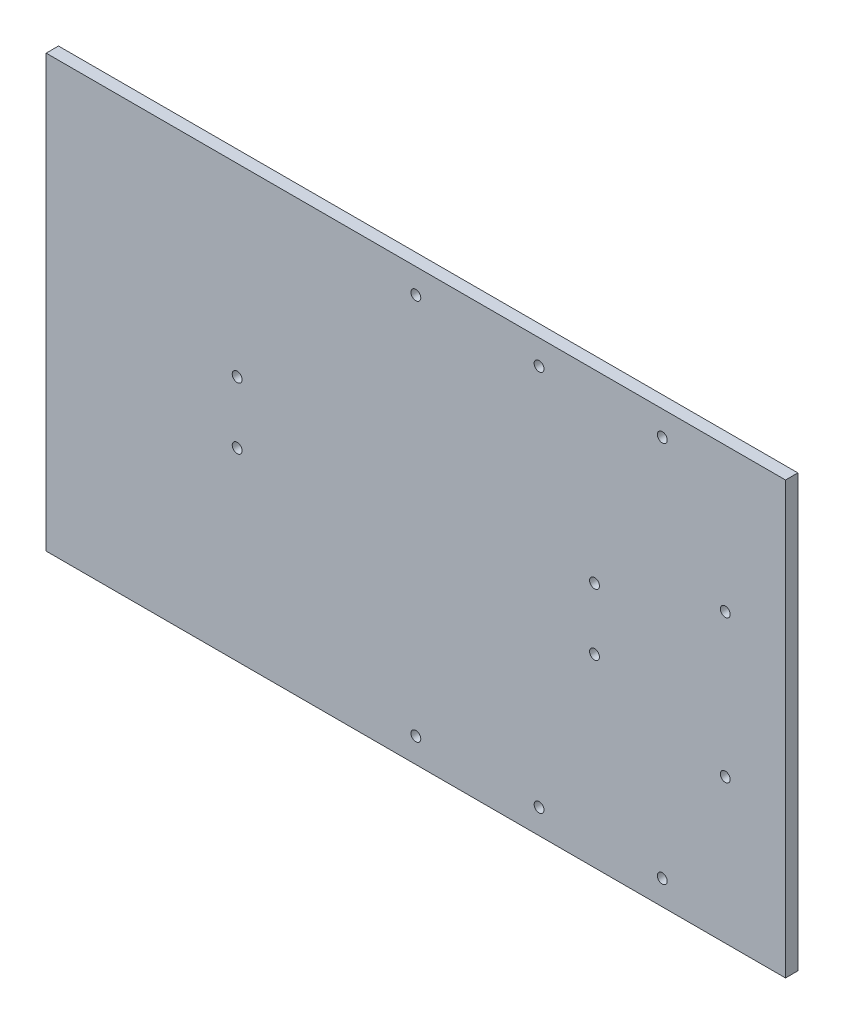
ISO-10303-21;
HEADER;
FILE_DESCRIPTION(('STEP AP214'),'2;1');
FILE_NAME('part.step','',(''),(''),'','','');
FILE_SCHEMA(('AUTOMOTIVE_DESIGN { 1 0 10303 214 1 1 1 1 }'));
ENDSEC;
DATA;
#1=APPLICATION_CONTEXT('core data for automotive mechanical design processes');
#2=APPLICATION_PROTOCOL_DEFINITION('international standard','automotive_design',2000,#1);
#3=PRODUCT_CONTEXT('',#1,'mechanical');
#4=PRODUCT('Part','Part','',(#3));
#5=PRODUCT_RELATED_PRODUCT_CATEGORY('part','',(#4));
#6=PRODUCT_DEFINITION_FORMATION('','',#4);
#7=PRODUCT_DEFINITION_CONTEXT('part definition',#1,'design');
#8=PRODUCT_DEFINITION('design','',#6,#7);
#9=PRODUCT_DEFINITION_SHAPE('','',#8);
#10=(LENGTH_UNIT() NAMED_UNIT(*) SI_UNIT(.MILLI.,.METRE.));
#11=(NAMED_UNIT(*) PLANE_ANGLE_UNIT() SI_UNIT($,.RADIAN.));
#12=(NAMED_UNIT(*) SI_UNIT($,.STERADIAN.) SOLID_ANGLE_UNIT());
#13=UNCERTAINTY_MEASURE_WITH_UNIT(LENGTH_MEASURE(1.E-05),#10,'distance_accuracy_value','');
#14=(GEOMETRIC_REPRESENTATION_CONTEXT(3) GLOBAL_UNCERTAINTY_ASSIGNED_CONTEXT((#13)) GLOBAL_UNIT_ASSIGNED_CONTEXT((#10,
#11,#12)) REPRESENTATION_CONTEXT('',''));
#15=CARTESIAN_POINT('',(0.,0.,0.));
#16=DIRECTION('',(0.,0.,1.));
#17=DIRECTION('',(1.,0.,0.));
#18=AXIS2_PLACEMENT_3D('',#15,#16,#17);
#19=CARTESIAN_POINT('',(0.,0.,10.));
#20=DIRECTION('',(-1.,0.,0.));
#21=DIRECTION('',(0.,0.,1.));
#22=AXIS2_PLACEMENT_3D('',#19,#20,#21);
#23=PLANE('',#22);
#24=DIRECTION('',(0.,1.,0.));
#25=VECTOR('',#24,1.);
#26=CARTESIAN_POINT('',(0.,0.,0.));
#27=LINE('',#26,#25);
#28=CARTESIAN_POINT('',(0.,0.,0.));
#29=VERTEX_POINT('',#28);
#30=CARTESIAN_POINT('',(0.,350.,0.));
#31=VERTEX_POINT('',#30);
#32=EDGE_CURVE('E97',#29,#31,#27,.T.);
#33=ORIENTED_EDGE('',*,*,#32,.T.);
#34=DIRECTION('',(0.,0.,-1.));
#35=VECTOR('',#34,1.);
#36=CARTESIAN_POINT('',(0.,350.,10.));
#37=LINE('',#36,#35);
#38=CARTESIAN_POINT('',(0.,350.,10.));
#39=VERTEX_POINT('',#38);
#40=EDGE_CURVE('E11',#39,#31,#37,.T.);
#41=ORIENTED_EDGE('',*,*,#40,.F.);
#42=DIRECTION('',(0.,1.,0.));
#43=VECTOR('',#42,1.);
#44=CARTESIAN_POINT('',(0.,0.,10.));
#45=LINE('',#44,#43);
#46=CARTESIAN_POINT('',(0.,0.,10.));
#47=VERTEX_POINT('',#46);
#48=EDGE_CURVE('E85',#47,#39,#45,.T.);
#49=ORIENTED_EDGE('',*,*,#48,.F.);
#50=DIRECTION('',(0.,0.,-1.));
#51=VECTOR('',#50,1.);
#52=CARTESIAN_POINT('',(0.,0.,10.));
#53=LINE('',#52,#51);
#54=EDGE_CURVE('E93',#47,#29,#53,.T.);
#55=ORIENTED_EDGE('',*,*,#54,.T.);
#56=EDGE_LOOP('',(#33,#41,#49,#55));
#57=FACE_BOUND('',#56,.T.);
#58=ADVANCED_FACE('F34',(#57),#23,.F.);
#59=CARTESIAN_POINT('',(0.,350.,10.));
#60=DIRECTION('',(0.,-1.,0.));
#61=DIRECTION('',(0.,0.,-1.));
#62=AXIS2_PLACEMENT_3D('',#59,#60,#61);
#63=PLANE('',#62);
#64=DIRECTION('',(-1.,0.,0.));
#65=VECTOR('',#64,1.);
#66=CARTESIAN_POINT('',(0.,350.,0.));
#67=LINE('',#66,#65);
#68=CARTESIAN_POINT('',(-600.,350.,0.));
#69=VERTEX_POINT('',#68);
#70=EDGE_CURVE('E89',#31,#69,#67,.T.);
#71=ORIENTED_EDGE('',*,*,#70,.T.);
#72=DIRECTION('',(0.,0.,-1.));
#73=VECTOR('',#72,1.);
#74=CARTESIAN_POINT('',(-600.,350.,10.));
#75=LINE('',#74,#73);
#76=CARTESIAN_POINT('',(-600.,350.,10.));
#77=VERTEX_POINT('',#76);
#78=EDGE_CURVE('E42',#77,#69,#75,.T.);
#79=ORIENTED_EDGE('',*,*,#78,.F.);
#80=DIRECTION('',(-1.,0.,0.));
#81=VECTOR('',#80,1.);
#82=CARTESIAN_POINT('',(0.,350.,10.));
#83=LINE('',#82,#81);
#84=EDGE_CURVE('E80',#39,#77,#83,.T.);
#85=ORIENTED_EDGE('',*,*,#84,.F.);
#86=ORIENTED_EDGE('',*,*,#40,.T.);
#87=EDGE_LOOP('',(#71,#79,#85,#86));
#88=FACE_BOUND('',#87,.T.);
#89=ADVANCED_FACE('F88',(#88),#63,.F.);
#90=CARTESIAN_POINT('',(-600.,0.,10.));
#91=DIRECTION('',(1.,0.,0.));
#92=DIRECTION('',(0.,0.,-1.));
#93=AXIS2_PLACEMENT_3D('',#90,#91,#92);
#94=PLANE('',#93);
#95=DIRECTION('',(0.,-1.,0.));
#96=VECTOR('',#95,1.);
#97=CARTESIAN_POINT('',(-600.,0.,0.));
#98=LINE('',#97,#96);
#99=CARTESIAN_POINT('',(-600.,0.,0.));
#100=VERTEX_POINT('',#99);
#101=EDGE_CURVE('E67',#69,#100,#98,.T.);
#102=ORIENTED_EDGE('',*,*,#101,.T.);
#103=DIRECTION('',(0.,0.,-1.));
#104=VECTOR('',#103,1.);
#105=CARTESIAN_POINT('',(-600.,0.,10.));
#106=LINE('',#105,#104);
#107=CARTESIAN_POINT('',(-600.,0.,10.));
#108=VERTEX_POINT('',#107);
#109=EDGE_CURVE('E90',#108,#100,#106,.T.);
#110=ORIENTED_EDGE('',*,*,#109,.F.);
#111=DIRECTION('',(0.,-1.,0.));
#112=VECTOR('',#111,1.);
#113=CARTESIAN_POINT('',(-600.,0.,10.));
#114=LINE('',#113,#112);
#115=EDGE_CURVE('E83',#77,#108,#114,.T.);
#116=ORIENTED_EDGE('',*,*,#115,.F.);
#117=ORIENTED_EDGE('',*,*,#78,.T.);
#118=EDGE_LOOP('',(#102,#110,#116,#117));
#119=FACE_BOUND('',#118,.T.);
#120=ADVANCED_FACE('F91',(#119),#94,.F.);
#121=CARTESIAN_POINT('',(0.,0.,10.));
#122=DIRECTION('',(0.,1.,0.));
#123=DIRECTION('',(-1.,0.,0.));
#124=AXIS2_PLACEMENT_3D('',#121,#122,#123);
#125=PLANE('',#124);
#126=DIRECTION('',(1.,0.,0.));
#127=VECTOR('',#126,1.);
#128=CARTESIAN_POINT('',(0.,0.,0.));
#129=LINE('',#128,#127);
#130=EDGE_CURVE('E73',#100,#29,#129,.T.);
#131=ORIENTED_EDGE('',*,*,#130,.T.);
#132=ORIENTED_EDGE('',*,*,#54,.F.);
#133=DIRECTION('',(1.,0.,0.));
#134=VECTOR('',#133,1.);
#135=CARTESIAN_POINT('',(0.,0.,10.));
#136=LINE('',#135,#134);
#137=EDGE_CURVE('E50',#108,#47,#136,.T.);
#138=ORIENTED_EDGE('',*,*,#137,.F.);
#139=ORIENTED_EDGE('',*,*,#109,.T.);
#140=EDGE_LOOP('',(#131,#132,#138,#139));
#141=FACE_BOUND('',#140,.T.);
#142=ADVANCED_FACE('F105',(#141),#125,.F.);
#143=CARTESIAN_POINT('',(0.,0.,10.));
#144=DIRECTION('',(0.,0.,1.));
#145=DIRECTION('',(1.,0.,0.));
#146=AXIS2_PLACEMENT_3D('',#143,#144,#145);
#147=PLANE('',#146);
#148=CARTESIAN_POINT('',(-155.,200.,10.));
#149=DIRECTION('',(0.,0.,1.));
#150=DIRECTION('',(1.,0.,0.));
#151=AXIS2_PLACEMENT_3D('',#148,#149,#150);
#152=CIRCLE('',#151,3.99999999999999);
#153=CARTESIAN_POINT('',(-151.,200.,10.));
#154=VERTEX_POINT('',#153);
#155=EDGE_CURVE('E172',#154,#154,#152,.F.);
#156=ORIENTED_EDGE('',*,*,#155,.T.);
#157=EDGE_LOOP('',(#156));
#158=FACE_BOUND('',#157,.T.);
#159=CARTESIAN_POINT('',(-445.,150.,10.));
#160=DIRECTION('',(0.,0.,1.));
#161=DIRECTION('',(1.,0.,0.));
#162=AXIS2_PLACEMENT_3D('',#159,#160,#161);
#163=CIRCLE('',#162,3.99999999999999);
#164=CARTESIAN_POINT('',(-441.,150.,10.));
#165=VERTEX_POINT('',#164);
#166=EDGE_CURVE('E165',#165,#165,#163,.F.);
#167=ORIENTED_EDGE('',*,*,#166,.T.);
#168=EDGE_LOOP('',(#167));
#169=FACE_BOUND('',#168,.T.);
#170=CARTESIAN_POINT('',(-445.,200.,10.));
#171=DIRECTION('',(0.,0.,1.));
#172=DIRECTION('',(1.,0.,0.));
#173=AXIS2_PLACEMENT_3D('',#170,#171,#172);
#174=CIRCLE('',#173,3.99999999999999);
#175=CARTESIAN_POINT('',(-441.,200.,10.));
#176=VERTEX_POINT('',#175);
#177=EDGE_CURVE('E177',#176,#176,#174,.F.);
#178=ORIENTED_EDGE('',*,*,#177,.T.);
#179=EDGE_LOOP('',(#178));
#180=FACE_BOUND('',#179,.T.);
#181=CARTESIAN_POINT('',(-155.,150.,10.));
#182=DIRECTION('',(0.,0.,1.));
#183=DIRECTION('',(1.,0.,0.));
#184=AXIS2_PLACEMENT_3D('',#181,#182,#183);
#185=CIRCLE('',#184,3.99999999999999);
#186=CARTESIAN_POINT('',(-151.,150.,10.));
#187=VERTEX_POINT('',#186);
#188=EDGE_CURVE('E159',#187,#187,#185,.F.);
#189=ORIENTED_EDGE('',*,*,#188,.T.);
#190=EDGE_LOOP('',(#189));
#191=FACE_BOUND('',#190,.T.);
#192=CARTESIAN_POINT('',(-48.9145975399393,233.,10.));
#193=DIRECTION('',(0.,0.,-1.));
#194=DIRECTION('',(-1.,0.,0.));
#195=AXIS2_PLACEMENT_3D('',#192,#193,#194);
#196=CIRCLE('',#195,4.);
#197=CARTESIAN_POINT('',(-52.9145975399393,233.,10.));
#198=VERTEX_POINT('',#197);
#199=EDGE_CURVE('E121',#198,#198,#196,.T.);
#200=ORIENTED_EDGE('',*,*,#199,.T.);
#201=EDGE_LOOP('',(#200));
#202=FACE_BOUND('',#201,.T.);
#203=CARTESIAN_POINT('',(-48.9145975399393,117.,10.));
#204=DIRECTION('',(0.,0.,-1.));
#205=DIRECTION('',(1.,0.,0.));
#206=AXIS2_PLACEMENT_3D('',#203,#204,#205);
#207=CIRCLE('',#206,4.);
#208=CARTESIAN_POINT('',(-44.9145975399393,117.,10.));
#209=VERTEX_POINT('',#208);
#210=EDGE_CURVE('E150',#209,#209,#207,.T.);
#211=ORIENTED_EDGE('',*,*,#210,.T.);
#212=EDGE_LOOP('',(#211));
#213=FACE_BOUND('',#212,.T.);
#214=CARTESIAN_POINT('',(-100.,20.,10.));
#215=DIRECTION('',(0.,0.,-1.));
#216=DIRECTION('',(1.,0.,0.));
#217=AXIS2_PLACEMENT_3D('',#214,#215,#216);
#218=CIRCLE('',#217,4.00000000000001);
#219=CARTESIAN_POINT('',(-96.,20.,10.));
#220=VERTEX_POINT('',#219);
#221=EDGE_CURVE('E120',#220,#220,#218,.T.);
#222=ORIENTED_EDGE('',*,*,#221,.T.);
#223=EDGE_LOOP('',(#222));
#224=FACE_BOUND('',#223,.T.);
#225=CARTESIAN_POINT('',(-200.,20.,10.));
#226=DIRECTION('',(0.,0.,-1.));
#227=DIRECTION('',(1.,0.,0.));
#228=AXIS2_PLACEMENT_3D('',#225,#226,#227);
#229=CIRCLE('',#228,3.99999999999999);
#230=CARTESIAN_POINT('',(-196.,20.,10.));
#231=VERTEX_POINT('',#230);
#232=EDGE_CURVE('E127',#231,#231,#229,.T.);
#233=ORIENTED_EDGE('',*,*,#232,.T.);
#234=EDGE_LOOP('',(#233));
#235=FACE_BOUND('',#234,.T.);
#236=CARTESIAN_POINT('',(-300.,20.,10.));
#237=DIRECTION('',(0.,0.,-1.));
#238=DIRECTION('',(1.,0.,0.));
#239=AXIS2_PLACEMENT_3D('',#236,#237,#238);
#240=CIRCLE('',#239,3.99999999999999);
#241=CARTESIAN_POINT('',(-296.,20.,10.));
#242=VERTEX_POINT('',#241);
#243=EDGE_CURVE('E133',#242,#242,#240,.T.);
#244=ORIENTED_EDGE('',*,*,#243,.T.);
#245=EDGE_LOOP('',(#244));
#246=FACE_BOUND('',#245,.T.);
#247=CARTESIAN_POINT('',(-300.,330.,10.));
#248=DIRECTION('',(0.,0.,-1.));
#249=DIRECTION('',(-1.,0.,0.));
#250=AXIS2_PLACEMENT_3D('',#247,#248,#249);
#251=CIRCLE('',#250,3.99999999999999);
#252=CARTESIAN_POINT('',(-304.,330.,10.));
#253=VERTEX_POINT('',#252);
#254=EDGE_CURVE('E139',#253,#253,#251,.T.);
#255=ORIENTED_EDGE('',*,*,#254,.T.);
#256=EDGE_LOOP('',(#255));
#257=FACE_BOUND('',#256,.T.);
#258=CARTESIAN_POINT('',(-200.,330.,10.));
#259=DIRECTION('',(0.,0.,-1.));
#260=DIRECTION('',(-1.,0.,0.));
#261=AXIS2_PLACEMENT_3D('',#258,#259,#260);
#262=CIRCLE('',#261,3.99999999999999);
#263=CARTESIAN_POINT('',(-204.,330.,10.));
#264=VERTEX_POINT('',#263);
#265=EDGE_CURVE('E114',#264,#264,#262,.T.);
#266=ORIENTED_EDGE('',*,*,#265,.T.);
#267=EDGE_LOOP('',(#266));
#268=FACE_BOUND('',#267,.T.);
#269=CARTESIAN_POINT('',(-100.,330.,10.));
#270=DIRECTION('',(0.,0.,-1.));
#271=DIRECTION('',(-1.,0.,0.));
#272=AXIS2_PLACEMENT_3D('',#269,#270,#271);
#273=CIRCLE('',#272,4.00000000000001);
#274=CARTESIAN_POINT('',(-104.,330.,10.));
#275=VERTEX_POINT('',#274);
#276=EDGE_CURVE('E100',#275,#275,#273,.T.);
#277=ORIENTED_EDGE('',*,*,#276,.T.);
#278=EDGE_LOOP('',(#277));
#279=FACE_BOUND('',#278,.T.);
#280=ORIENTED_EDGE('',*,*,#48,.T.);
#281=ORIENTED_EDGE('',*,*,#84,.T.);
#282=ORIENTED_EDGE('',*,*,#115,.T.);
#283=ORIENTED_EDGE('',*,*,#137,.T.);
#284=EDGE_LOOP('',(#280,#281,#282,#283));
#285=FACE_BOUND('',#284,.T.);
#286=ADVANCED_FACE('F81',(#158,#169,#180,#191,#202,#213,#224,#235,#246,#257,#268,#279,#285),
#147,.T.);
#287=CARTESIAN_POINT('',(0.,0.,0.));
#288=DIRECTION('',(0.,0.,1.));
#289=DIRECTION('',(1.,0.,0.));
#290=AXIS2_PLACEMENT_3D('',#287,#288,#289);
#291=PLANE('',#290);
#292=CARTESIAN_POINT('',(-155.,200.,0.));
#293=DIRECTION('',(0.,0.,-1.));
#294=DIRECTION('',(1.,0.,0.));
#295=AXIS2_PLACEMENT_3D('',#292,#293,#294);
#296=CIRCLE('',#295,3.99999999999999);
#297=CARTESIAN_POINT('',(-151.,200.,0.));
#298=VERTEX_POINT('',#297);
#299=EDGE_CURVE('E162',#298,#298,#296,.T.);
#300=ORIENTED_EDGE('',*,*,#299,.F.);
#301=EDGE_LOOP('',(#300));
#302=FACE_BOUND('',#301,.T.);
#303=CARTESIAN_POINT('',(-445.,150.,0.));
#304=DIRECTION('',(0.,0.,-1.));
#305=DIRECTION('',(1.,0.,0.));
#306=AXIS2_PLACEMENT_3D('',#303,#304,#305);
#307=CIRCLE('',#306,3.99999999999999);
#308=CARTESIAN_POINT('',(-441.,150.,0.));
#309=VERTEX_POINT('',#308);
#310=EDGE_CURVE('E168',#309,#309,#307,.T.);
#311=ORIENTED_EDGE('',*,*,#310,.F.);
#312=EDGE_LOOP('',(#311));
#313=FACE_BOUND('',#312,.T.);
#314=CARTESIAN_POINT('',(-445.,200.,0.));
#315=DIRECTION('',(0.,0.,-1.));
#316=DIRECTION('',(-1.,0.,0.));
#317=AXIS2_PLACEMENT_3D('',#314,#315,#316);
#318=CIRCLE('',#317,3.99999999999999);
#319=CARTESIAN_POINT('',(-449.,200.,0.));
#320=VERTEX_POINT('',#319);
#321=EDGE_CURVE('E169',#320,#320,#318,.T.);
#322=ORIENTED_EDGE('',*,*,#321,.F.);
#323=EDGE_LOOP('',(#322));
#324=FACE_BOUND('',#323,.T.);
#325=CARTESIAN_POINT('',(-155.,150.,0.));
#326=DIRECTION('',(0.,0.,-1.));
#327=DIRECTION('',(-1.,0.,0.));
#328=AXIS2_PLACEMENT_3D('',#325,#326,#327);
#329=CIRCLE('',#328,3.99999999999999);
#330=CARTESIAN_POINT('',(-159.,150.,0.));
#331=VERTEX_POINT('',#330);
#332=EDGE_CURVE('E151',#331,#331,#329,.T.);
#333=ORIENTED_EDGE('',*,*,#332,.F.);
#334=EDGE_LOOP('',(#333));
#335=FACE_BOUND('',#334,.T.);
#336=CARTESIAN_POINT('',(-48.9145975399393,233.,0.));
#337=DIRECTION('',(0.,0.,-1.));
#338=DIRECTION('',(-1.,0.,0.));
#339=AXIS2_PLACEMENT_3D('',#336,#337,#338);
#340=CIRCLE('',#339,4.);
#341=CARTESIAN_POINT('',(-52.9145975399393,233.,0.));
#342=VERTEX_POINT('',#341);
#343=EDGE_CURVE('E154',#342,#342,#340,.T.);
#344=ORIENTED_EDGE('',*,*,#343,.F.);
#345=EDGE_LOOP('',(#344));
#346=FACE_BOUND('',#345,.T.);
#347=CARTESIAN_POINT('',(-48.9145975399393,117.,0.));
#348=DIRECTION('',(0.,0.,-1.));
#349=DIRECTION('',(1.,0.,0.));
#350=AXIS2_PLACEMENT_3D('',#347,#348,#349);
#351=CIRCLE('',#350,4.);
#352=CARTESIAN_POINT('',(-44.9145975399393,117.,0.));
#353=VERTEX_POINT('',#352);
#354=EDGE_CURVE('E147',#353,#353,#351,.T.);
#355=ORIENTED_EDGE('',*,*,#354,.F.);
#356=EDGE_LOOP('',(#355));
#357=FACE_BOUND('',#356,.T.);
#358=CARTESIAN_POINT('',(-100.,20.,0.));
#359=DIRECTION('',(0.,0.,-1.));
#360=DIRECTION('',(1.,0.,0.));
#361=AXIS2_PLACEMENT_3D('',#358,#359,#360);
#362=CIRCLE('',#361,4.00000000000001);
#363=CARTESIAN_POINT('',(-96.,20.,0.));
#364=VERTEX_POINT('',#363);
#365=EDGE_CURVE('E117',#364,#364,#362,.T.);
#366=ORIENTED_EDGE('',*,*,#365,.F.);
#367=EDGE_LOOP('',(#366));
#368=FACE_BOUND('',#367,.T.);
#369=CARTESIAN_POINT('',(-200.,20.,0.));
#370=DIRECTION('',(0.,0.,-1.));
#371=DIRECTION('',(1.,0.,0.));
#372=AXIS2_PLACEMENT_3D('',#369,#370,#371);
#373=CIRCLE('',#372,3.99999999999999);
#374=CARTESIAN_POINT('',(-196.,20.,0.));
#375=VERTEX_POINT('',#374);
#376=EDGE_CURVE('E124',#375,#375,#373,.T.);
#377=ORIENTED_EDGE('',*,*,#376,.F.);
#378=EDGE_LOOP('',(#377));
#379=FACE_BOUND('',#378,.T.);
#380=CARTESIAN_POINT('',(-300.,20.,0.));
#381=DIRECTION('',(0.,0.,-1.));
#382=DIRECTION('',(1.,0.,0.));
#383=AXIS2_PLACEMENT_3D('',#380,#381,#382);
#384=CIRCLE('',#383,3.99999999999999);
#385=CARTESIAN_POINT('',(-296.,20.,0.));
#386=VERTEX_POINT('',#385);
#387=EDGE_CURVE('E130',#386,#386,#384,.T.);
#388=ORIENTED_EDGE('',*,*,#387,.F.);
#389=EDGE_LOOP('',(#388));
#390=FACE_BOUND('',#389,.T.);
#391=CARTESIAN_POINT('',(-300.,330.,0.));
#392=DIRECTION('',(0.,0.,-1.));
#393=DIRECTION('',(-1.,0.,0.));
#394=AXIS2_PLACEMENT_3D('',#391,#392,#393);
#395=CIRCLE('',#394,3.99999999999999);
#396=CARTESIAN_POINT('',(-304.,330.,0.));
#397=VERTEX_POINT('',#396);
#398=EDGE_CURVE('E136',#397,#397,#395,.T.);
#399=ORIENTED_EDGE('',*,*,#398,.F.);
#400=EDGE_LOOP('',(#399));
#401=FACE_BOUND('',#400,.T.);
#402=CARTESIAN_POINT('',(-200.,330.,0.));
#403=DIRECTION('',(0.,0.,-1.));
#404=DIRECTION('',(-1.,0.,0.));
#405=AXIS2_PLACEMENT_3D('',#402,#403,#404);
#406=CIRCLE('',#405,3.99999999999999);
#407=CARTESIAN_POINT('',(-204.,330.,0.));
#408=VERTEX_POINT('',#407);
#409=EDGE_CURVE('E142',#408,#408,#406,.T.);
#410=ORIENTED_EDGE('',*,*,#409,.F.);
#411=EDGE_LOOP('',(#410));
#412=FACE_BOUND('',#411,.T.);
#413=CARTESIAN_POINT('',(-100.,330.,0.));
#414=DIRECTION('',(0.,0.,-1.));
#415=DIRECTION('',(-1.,0.,0.));
#416=AXIS2_PLACEMENT_3D('',#413,#414,#415);
#417=CIRCLE('',#416,4.00000000000001);
#418=CARTESIAN_POINT('',(-104.,330.,0.));
#419=VERTEX_POINT('',#418);
#420=EDGE_CURVE('E111',#419,#419,#417,.T.);
#421=ORIENTED_EDGE('',*,*,#420,.F.);
#422=EDGE_LOOP('',(#421));
#423=FACE_BOUND('',#422,.T.);
#424=ORIENTED_EDGE('',*,*,#32,.F.);
#425=ORIENTED_EDGE('',*,*,#130,.F.);
#426=ORIENTED_EDGE('',*,*,#101,.F.);
#427=ORIENTED_EDGE('',*,*,#70,.F.);
#428=EDGE_LOOP('',(#424,#425,#426,#427));
#429=FACE_BOUND('',#428,.T.);
#430=ADVANCED_FACE('F108',(#302,#313,#324,#335,#346,#357,#368,#379,#390,#401,#412,#423,#429),
#291,.F.);
#431=CARTESIAN_POINT('',(-100.,330.,10.));
#432=DIRECTION('',(0.,0.,-1.));
#433=DIRECTION('',(-1.,0.,0.));
#434=AXIS2_PLACEMENT_3D('',#431,#432,#433);
#435=CYLINDRICAL_SURFACE('',#434,4.00000000000001);
#436=ORIENTED_EDGE('',*,*,#276,.F.);
#437=EDGE_LOOP('',(#436));
#438=FACE_BOUND('',#437,.T.);
#439=ORIENTED_EDGE('',*,*,#420,.T.);
#440=EDGE_LOOP('',(#439));
#441=FACE_BOUND('',#440,.T.);
#442=ADVANCED_FACE('F187',(#438,#441),#435,.F.);
#443=CARTESIAN_POINT('',(-200.,330.,10.));
#444=DIRECTION('',(0.,0.,-1.));
#445=DIRECTION('',(-1.,0.,0.));
#446=AXIS2_PLACEMENT_3D('',#443,#444,#445);
#447=CYLINDRICAL_SURFACE('',#446,3.99999999999999);
#448=ORIENTED_EDGE('',*,*,#265,.F.);
#449=EDGE_LOOP('',(#448));
#450=FACE_BOUND('',#449,.T.);
#451=ORIENTED_EDGE('',*,*,#409,.T.);
#452=EDGE_LOOP('',(#451));
#453=FACE_BOUND('',#452,.T.);
#454=ADVANCED_FACE('F209',(#450,#453),#447,.F.);
#455=CARTESIAN_POINT('',(-300.,330.,10.));
#456=DIRECTION('',(0.,0.,-1.));
#457=DIRECTION('',(-1.,0.,0.));
#458=AXIS2_PLACEMENT_3D('',#455,#456,#457);
#459=CYLINDRICAL_SURFACE('',#458,3.99999999999999);
#460=ORIENTED_EDGE('',*,*,#254,.F.);
#461=EDGE_LOOP('',(#460));
#462=FACE_BOUND('',#461,.T.);
#463=ORIENTED_EDGE('',*,*,#398,.T.);
#464=EDGE_LOOP('',(#463));
#465=FACE_BOUND('',#464,.T.);
#466=ADVANCED_FACE('F215',(#462,#465),#459,.F.);
#467=CARTESIAN_POINT('',(-300.,20.,10.));
#468=DIRECTION('',(0.,0.,-1.));
#469=DIRECTION('',(-1.,0.,0.));
#470=AXIS2_PLACEMENT_3D('',#467,#468,#469);
#471=CYLINDRICAL_SURFACE('',#470,3.99999999999999);
#472=ORIENTED_EDGE('',*,*,#243,.F.);
#473=EDGE_LOOP('',(#472));
#474=FACE_BOUND('',#473,.T.);
#475=ORIENTED_EDGE('',*,*,#387,.T.);
#476=EDGE_LOOP('',(#475));
#477=FACE_BOUND('',#476,.T.);
#478=ADVANCED_FACE('F261',(#474,#477),#471,.F.);
#479=CARTESIAN_POINT('',(-200.,20.,10.));
#480=DIRECTION('',(0.,0.,-1.));
#481=DIRECTION('',(-1.,0.,0.));
#482=AXIS2_PLACEMENT_3D('',#479,#480,#481);
#483=CYLINDRICAL_SURFACE('',#482,3.99999999999999);
#484=ORIENTED_EDGE('',*,*,#232,.F.);
#485=EDGE_LOOP('',(#484));
#486=FACE_BOUND('',#485,.T.);
#487=ORIENTED_EDGE('',*,*,#376,.T.);
#488=EDGE_LOOP('',(#487));
#489=FACE_BOUND('',#488,.T.);
#490=ADVANCED_FACE('F266',(#486,#489),#483,.F.);
#491=CARTESIAN_POINT('',(-100.,20.,10.));
#492=DIRECTION('',(0.,0.,-1.));
#493=DIRECTION('',(-1.,0.,0.));
#494=AXIS2_PLACEMENT_3D('',#491,#492,#493);
#495=CYLINDRICAL_SURFACE('',#494,4.00000000000001);
#496=ORIENTED_EDGE('',*,*,#221,.F.);
#497=EDGE_LOOP('',(#496));
#498=FACE_BOUND('',#497,.T.);
#499=ORIENTED_EDGE('',*,*,#365,.T.);
#500=EDGE_LOOP('',(#499));
#501=FACE_BOUND('',#500,.T.);
#502=ADVANCED_FACE('F272',(#498,#501),#495,.F.);
#503=CARTESIAN_POINT('',(-48.9145975399393,117.,10.));
#504=DIRECTION('',(0.,0.,-1.));
#505=DIRECTION('',(-1.,0.,0.));
#506=AXIS2_PLACEMENT_3D('',#503,#504,#505);
#507=CYLINDRICAL_SURFACE('',#506,4.);
#508=ORIENTED_EDGE('',*,*,#210,.F.);
#509=EDGE_LOOP('',(#508));
#510=FACE_BOUND('',#509,.T.);
#511=ORIENTED_EDGE('',*,*,#354,.T.);
#512=EDGE_LOOP('',(#511));
#513=FACE_BOUND('',#512,.T.);
#514=ADVANCED_FACE('F275',(#510,#513),#507,.F.);
#515=CARTESIAN_POINT('',(-48.9145975399393,233.,10.));
#516=DIRECTION('',(0.,0.,-1.));
#517=DIRECTION('',(-1.,0.,0.));
#518=AXIS2_PLACEMENT_3D('',#515,#516,#517);
#519=CYLINDRICAL_SURFACE('',#518,4.);
#520=ORIENTED_EDGE('',*,*,#199,.F.);
#521=EDGE_LOOP('',(#520));
#522=FACE_BOUND('',#521,.T.);
#523=ORIENTED_EDGE('',*,*,#343,.T.);
#524=EDGE_LOOP('',(#523));
#525=FACE_BOUND('',#524,.T.);
#526=ADVANCED_FACE('F280',(#522,#525),#519,.F.);
#527=CARTESIAN_POINT('',(-155.,150.,10.001));
#528=DIRECTION('',(0.,0.,-1.));
#529=DIRECTION('',(-1.,0.,0.));
#530=AXIS2_PLACEMENT_3D('',#527,#528,#529);
#531=CYLINDRICAL_SURFACE('',#530,3.99999999999999);
#532=ORIENTED_EDGE('',*,*,#188,.F.);
#533=EDGE_LOOP('',(#532));
#534=FACE_BOUND('',#533,.T.);
#535=ORIENTED_EDGE('',*,*,#332,.T.);
#536=EDGE_LOOP('',(#535));
#537=FACE_BOUND('',#536,.T.);
#538=ADVANCED_FACE('F286',(#534,#537),#531,.F.);
#539=CARTESIAN_POINT('',(-445.,200.,10.001));
#540=DIRECTION('',(0.,0.,-1.));
#541=DIRECTION('',(-1.,0.,0.));
#542=AXIS2_PLACEMENT_3D('',#539,#540,#541);
#543=CYLINDRICAL_SURFACE('',#542,3.99999999999999);
#544=ORIENTED_EDGE('',*,*,#177,.F.);
#545=EDGE_LOOP('',(#544));
#546=FACE_BOUND('',#545,.T.);
#547=ORIENTED_EDGE('',*,*,#321,.T.);
#548=EDGE_LOOP('',(#547));
#549=FACE_BOUND('',#548,.T.);
#550=ADVANCED_FACE('F183',(#546,#549),#543,.F.);
#551=CARTESIAN_POINT('',(-445.,150.,10.001));
#552=DIRECTION('',(0.,0.,-1.));
#553=DIRECTION('',(-1.,0.,0.));
#554=AXIS2_PLACEMENT_3D('',#551,#552,#553);
#555=CYLINDRICAL_SURFACE('',#554,3.99999999999999);
#556=ORIENTED_EDGE('',*,*,#166,.F.);
#557=EDGE_LOOP('',(#556));
#558=FACE_BOUND('',#557,.T.);
#559=ORIENTED_EDGE('',*,*,#310,.T.);
#560=EDGE_LOOP('',(#559));
#561=FACE_BOUND('',#560,.T.);
#562=ADVANCED_FACE('F294',(#558,#561),#555,.F.);
#563=CARTESIAN_POINT('',(-155.,200.,10.001));
#564=DIRECTION('',(0.,0.,-1.));
#565=DIRECTION('',(-1.,0.,0.));
#566=AXIS2_PLACEMENT_3D('',#563,#564,#565);
#567=CYLINDRICAL_SURFACE('',#566,3.99999999999999);
#568=ORIENTED_EDGE('',*,*,#155,.F.);
#569=EDGE_LOOP('',(#568));
#570=FACE_BOUND('',#569,.T.);
#571=ORIENTED_EDGE('',*,*,#299,.T.);
#572=EDGE_LOOP('',(#571));
#573=FACE_BOUND('',#572,.T.);
#574=ADVANCED_FACE('F297',(#570,#573),#567,.F.);
#575=CLOSED_SHELL('',(#58,#89,#120,#142,#286,#430,#442,#454,#466,#478,#490,#502,#514,#526,#538,
#550,#562,#574));
#576=MANIFOLD_SOLID_BREP('B2',#575);
#577=ADVANCED_BREP_SHAPE_REPRESENTATION('',(#18,#576),#14);
#578=SHAPE_DEFINITION_REPRESENTATION(#9,#577);
ENDSEC;
END-ISO-10303-21;
